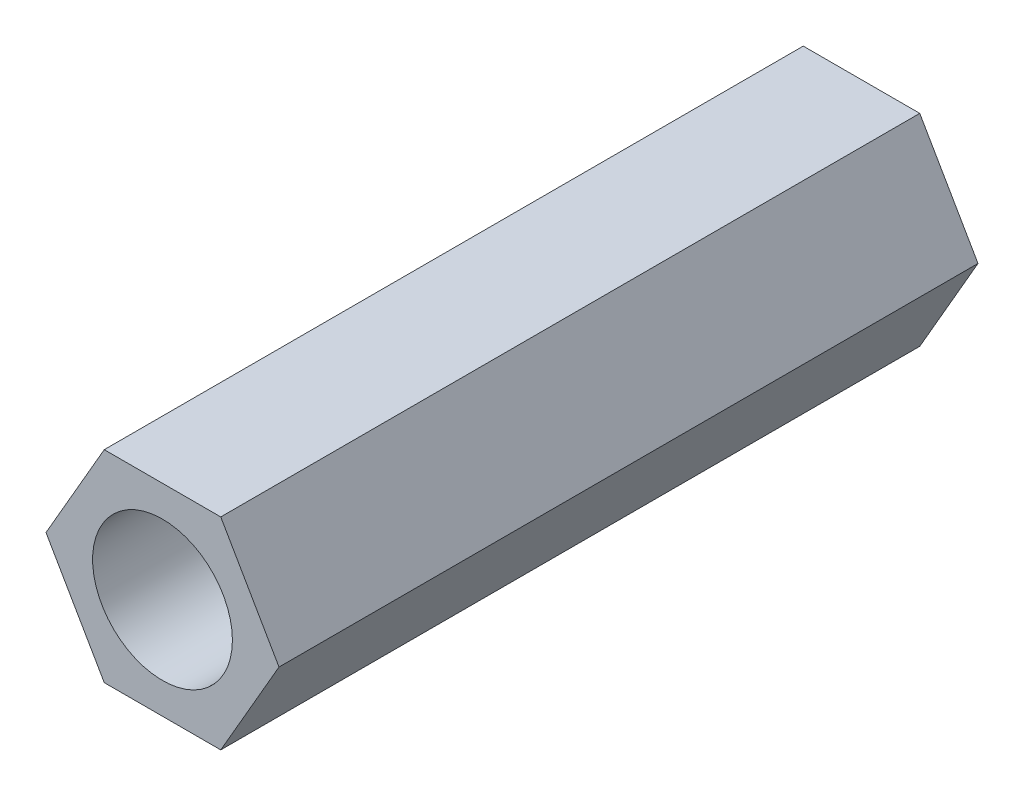
ISO-10303-21;
HEADER;
FILE_DESCRIPTION(('STEP AP214'),'2;1');
FILE_NAME('part.step','',(''),(''),'','','');
FILE_SCHEMA(('AUTOMOTIVE_DESIGN { 1 0 10303 214 1 1 1 1 }'));
ENDSEC;
DATA;
#1=APPLICATION_CONTEXT('core data for automotive mechanical design processes');
#2=APPLICATION_PROTOCOL_DEFINITION('international standard','automotive_design',2000,#1);
#3=PRODUCT_CONTEXT('',#1,'mechanical');
#4=PRODUCT('Part','Part','',(#3));
#5=PRODUCT_RELATED_PRODUCT_CATEGORY('part','',(#4));
#6=PRODUCT_DEFINITION_FORMATION('','',#4);
#7=PRODUCT_DEFINITION_CONTEXT('part definition',#1,'design');
#8=PRODUCT_DEFINITION('design','',#6,#7);
#9=PRODUCT_DEFINITION_SHAPE('','',#8);
#10=(LENGTH_UNIT() NAMED_UNIT(*) SI_UNIT(.MILLI.,.METRE.));
#11=(NAMED_UNIT(*) PLANE_ANGLE_UNIT() SI_UNIT($,.RADIAN.));
#12=(NAMED_UNIT(*) SI_UNIT($,.STERADIAN.) SOLID_ANGLE_UNIT());
#13=UNCERTAINTY_MEASURE_WITH_UNIT(LENGTH_MEASURE(1.E-05),#10,'distance_accuracy_value','');
#14=(GEOMETRIC_REPRESENTATION_CONTEXT(3) GLOBAL_UNCERTAINTY_ASSIGNED_CONTEXT((#13)) GLOBAL_UNIT_ASSIGNED_CONTEXT((#10,
#11,#12)) REPRESENTATION_CONTEXT('',''));
#15=CARTESIAN_POINT('',(0.,0.,0.));
#16=DIRECTION('',(0.,0.,1.));
#17=DIRECTION('',(1.,0.,0.));
#18=AXIS2_PLACEMENT_3D('',#15,#16,#17);
#19=CARTESIAN_POINT('',(0.,0.,15.));
#20=DIRECTION('',(0.,0.,1.));
#21=DIRECTION('',(1.,0.,0.));
#22=AXIS2_PLACEMENT_3D('',#19,#20,#21);
#23=PLANE('',#22);
#24=DIRECTION('',(0.499999999999995,0.866025403784441,0.));
#25=VECTOR('',#24,1.);
#26=CARTESIAN_POINT('',(1.25000000000002,-2.16506350946108,15.));
#27=LINE('',#26,#25);
#28=CARTESIAN_POINT('',(1.25000000000002,-2.16506350946108,15.));
#29=VERTEX_POINT('',#28);
#30=CARTESIAN_POINT('',(2.5,0.,15.));
#31=VERTEX_POINT('',#30);
#32=EDGE_CURVE('E152',#29,#31,#27,.T.);
#33=ORIENTED_EDGE('',*,*,#32,.T.);
#34=DIRECTION('',(-0.500000000000001,0.866025403784438,0.));
#35=VECTOR('',#34,1.);
#36=CARTESIAN_POINT('',(2.5,0.,15.));
#37=LINE('',#36,#35);
#38=CARTESIAN_POINT('',(1.25,2.1650635094611,15.));
#39=VERTEX_POINT('',#38);
#40=EDGE_CURVE('E100',#31,#39,#37,.T.);
#41=ORIENTED_EDGE('',*,*,#40,.T.);
#42=DIRECTION('',(-1.,0.,0.));
#43=VECTOR('',#42,1.);
#44=CARTESIAN_POINT('',(1.25,2.1650635094611,15.));
#45=LINE('',#44,#43);
#46=CARTESIAN_POINT('',(-1.25000000000001,2.16506350946109,15.));
#47=VERTEX_POINT('',#46);
#48=EDGE_CURVE('E113',#39,#47,#45,.T.);
#49=ORIENTED_EDGE('',*,*,#48,.T.);
#50=DIRECTION('',(-0.499999999999995,-0.866025403784442,0.));
#51=VECTOR('',#50,1.);
#52=CARTESIAN_POINT('',(-1.25000000000001,2.16506350946109,15.));
#53=LINE('',#52,#51);
#54=CARTESIAN_POINT('',(-2.5,0.,15.));
#55=VERTEX_POINT('',#54);
#56=EDGE_CURVE('E107',#47,#55,#53,.T.);
#57=ORIENTED_EDGE('',*,*,#56,.T.);
#58=DIRECTION('',(0.500000000000007,-0.866025403784434,0.));
#59=VECTOR('',#58,1.);
#60=CARTESIAN_POINT('',(-2.5,0.,15.));
#61=LINE('',#60,#59);
#62=CARTESIAN_POINT('',(-1.24999999999998,-2.16506350946111,15.));
#63=VERTEX_POINT('',#62);
#64=EDGE_CURVE('E111',#55,#63,#61,.T.);
#65=ORIENTED_EDGE('',*,*,#64,.T.);
#66=DIRECTION('',(1.,0.,0.));
#67=VECTOR('',#66,1.);
#68=CARTESIAN_POINT('',(-1.24999999999998,-2.16506350946111,15.));
#69=LINE('',#68,#67);
#70=EDGE_CURVE('E63',#63,#29,#69,.T.);
#71=ORIENTED_EDGE('',*,*,#70,.T.);
#72=EDGE_LOOP('',(#33,#41,#49,#57,#65,#71));
#73=FACE_BOUND('',#72,.T.);
#74=CARTESIAN_POINT('',(0.,0.,15.));
#75=DIRECTION('',(0.,0.,1.));
#76=DIRECTION('',(1.,0.,0.));
#77=AXIS2_PLACEMENT_3D('',#74,#75,#76);
#78=CIRCLE('',#77,1.5);
#79=CARTESIAN_POINT('',(1.5,0.,15.));
#80=VERTEX_POINT('',#79);
#81=EDGE_CURVE('E140',#80,#80,#78,.T.);
#82=ORIENTED_EDGE('',*,*,#81,.F.);
#83=EDGE_LOOP('',(#82));
#84=FACE_BOUND('',#83,.T.);
#85=ADVANCED_FACE('F45',(#73,#84),#23,.T.);
#86=CARTESIAN_POINT('',(0.,0.,0.));
#87=DIRECTION('',(0.,0.,1.));
#88=DIRECTION('',(1.,0.,0.));
#89=AXIS2_PLACEMENT_3D('',#86,#87,#88);
#90=PLANE('',#89);
#91=DIRECTION('',(0.499999999999995,0.866025403784441,0.));
#92=VECTOR('',#91,1.);
#93=CARTESIAN_POINT('',(1.25000000000002,-2.16506350946108,0.));
#94=LINE('',#93,#92);
#95=CARTESIAN_POINT('',(1.25000000000002,-2.16506350946108,0.));
#96=VERTEX_POINT('',#95);
#97=CARTESIAN_POINT('',(2.5,0.,0.));
#98=VERTEX_POINT('',#97);
#99=EDGE_CURVE('E135',#96,#98,#94,.T.);
#100=ORIENTED_EDGE('',*,*,#99,.F.);
#101=DIRECTION('',(1.,0.,0.));
#102=VECTOR('',#101,1.);
#103=CARTESIAN_POINT('',(-1.24999999999998,-2.16506350946111,0.));
#104=LINE('',#103,#102);
#105=CARTESIAN_POINT('',(-1.24999999999998,-2.16506350946111,0.));
#106=VERTEX_POINT('',#105);
#107=EDGE_CURVE('E92',#106,#96,#104,.T.);
#108=ORIENTED_EDGE('',*,*,#107,.F.);
#109=DIRECTION('',(0.500000000000007,-0.866025403784434,0.));
#110=VECTOR('',#109,1.);
#111=CARTESIAN_POINT('',(-2.5,0.,0.));
#112=LINE('',#111,#110);
#113=CARTESIAN_POINT('',(-2.5,0.,0.));
#114=VERTEX_POINT('',#113);
#115=EDGE_CURVE('E86',#114,#106,#112,.T.);
#116=ORIENTED_EDGE('',*,*,#115,.F.);
#117=DIRECTION('',(-0.499999999999995,-0.866025403784442,0.));
#118=VECTOR('',#117,1.);
#119=CARTESIAN_POINT('',(-1.25000000000001,2.16506350946109,0.));
#120=LINE('',#119,#118);
#121=CARTESIAN_POINT('',(-1.25000000000001,2.16506350946109,0.));
#122=VERTEX_POINT('',#121);
#123=EDGE_CURVE('E122',#122,#114,#120,.T.);
#124=ORIENTED_EDGE('',*,*,#123,.F.);
#125=DIRECTION('',(-1.,0.,0.));
#126=VECTOR('',#125,1.);
#127=CARTESIAN_POINT('',(1.25,2.1650635094611,0.));
#128=LINE('',#127,#126);
#129=CARTESIAN_POINT('',(1.25,2.1650635094611,0.));
#130=VERTEX_POINT('',#129);
#131=EDGE_CURVE('E143',#130,#122,#128,.T.);
#132=ORIENTED_EDGE('',*,*,#131,.F.);
#133=DIRECTION('',(-0.500000000000001,0.866025403784438,0.));
#134=VECTOR('',#133,1.);
#135=CARTESIAN_POINT('',(2.5,0.,0.));
#136=LINE('',#135,#134);
#137=EDGE_CURVE('E139',#98,#130,#136,.T.);
#138=ORIENTED_EDGE('',*,*,#137,.F.);
#139=EDGE_LOOP('',(#100,#108,#116,#124,#132,#138));
#140=FACE_BOUND('',#139,.T.);
#141=CARTESIAN_POINT('',(0.,0.,0.));
#142=DIRECTION('',(0.,0.,1.));
#143=DIRECTION('',(1.,0.,0.));
#144=AXIS2_PLACEMENT_3D('',#141,#142,#143);
#145=CIRCLE('',#144,1.5);
#146=CARTESIAN_POINT('',(1.5,0.,0.));
#147=VERTEX_POINT('',#146);
#148=EDGE_CURVE('E249',#147,#147,#145,.T.);
#149=ORIENTED_EDGE('',*,*,#148,.T.);
#150=EDGE_LOOP('',(#149));
#151=FACE_BOUND('',#150,.T.);
#152=ADVANCED_FACE('F165',(#140,#151),#90,.F.);
#153=CARTESIAN_POINT('',(1.25000000000002,-2.16506350946108,15.));
#154=DIRECTION('',(-0.866025403784441,0.499999999999995,0.));
#155=DIRECTION('',(-0.499999999999995,-0.866025403784441,0.));
#156=AXIS2_PLACEMENT_3D('',#153,#154,#155);
#157=PLANE('',#156);
#158=ORIENTED_EDGE('',*,*,#99,.T.);
#159=DIRECTION('',(0.,0.,-1.));
#160=VECTOR('',#159,1.);
#161=CARTESIAN_POINT('',(2.5,0.,15.));
#162=LINE('',#161,#160);
#163=EDGE_CURVE('E11',#31,#98,#162,.T.);
#164=ORIENTED_EDGE('',*,*,#163,.F.);
#165=ORIENTED_EDGE('',*,*,#32,.F.);
#166=DIRECTION('',(0.,0.,-1.));
#167=VECTOR('',#166,1.);
#168=CARTESIAN_POINT('',(1.25000000000002,-2.16506350946108,15.));
#169=LINE('',#168,#167);
#170=EDGE_CURVE('E131',#29,#96,#169,.T.);
#171=ORIENTED_EDGE('',*,*,#170,.T.);
#172=EDGE_LOOP('',(#158,#164,#165,#171));
#173=FACE_BOUND('',#172,.T.);
#174=ADVANCED_FACE('F47',(#173),#157,.F.);
#175=CARTESIAN_POINT('',(2.5,0.,15.));
#176=DIRECTION('',(-0.866025403784438,-0.500000000000001,0.));
#177=DIRECTION('',(0.500000000000001,-0.866025403784438,0.));
#178=AXIS2_PLACEMENT_3D('',#175,#176,#177);
#179=PLANE('',#178);
#180=ORIENTED_EDGE('',*,*,#137,.T.);
#181=DIRECTION('',(0.,0.,-1.));
#182=VECTOR('',#181,1.);
#183=CARTESIAN_POINT('',(1.25,2.1650635094611,15.));
#184=LINE('',#183,#182);
#185=EDGE_CURVE('E55',#39,#130,#184,.T.);
#186=ORIENTED_EDGE('',*,*,#185,.F.);
#187=ORIENTED_EDGE('',*,*,#40,.F.);
#188=ORIENTED_EDGE('',*,*,#163,.T.);
#189=EDGE_LOOP('',(#180,#186,#187,#188));
#190=FACE_BOUND('',#189,.T.);
#191=ADVANCED_FACE('F190',(#190),#179,.F.);
#192=CARTESIAN_POINT('',(1.25,2.1650635094611,15.));
#193=DIRECTION('',(0.,-1.,0.));
#194=DIRECTION('',(1.,0.,0.));
#195=AXIS2_PLACEMENT_3D('',#192,#193,#194);
#196=PLANE('',#195);
#197=ORIENTED_EDGE('',*,*,#131,.T.);
#198=DIRECTION('',(0.,0.,-1.));
#199=VECTOR('',#198,1.);
#200=CARTESIAN_POINT('',(-1.25000000000001,2.16506350946109,15.));
#201=LINE('',#200,#199);
#202=EDGE_CURVE('E124',#47,#122,#201,.T.);
#203=ORIENTED_EDGE('',*,*,#202,.F.);
#204=ORIENTED_EDGE('',*,*,#48,.F.);
#205=ORIENTED_EDGE('',*,*,#185,.T.);
#206=EDGE_LOOP('',(#197,#203,#204,#205));
#207=FACE_BOUND('',#206,.T.);
#208=ADVANCED_FACE('F162',(#207),#196,.F.);
#209=CARTESIAN_POINT('',(-1.25000000000001,2.16506350946109,15.));
#210=DIRECTION('',(0.866025403784442,-0.499999999999995,0.));
#211=DIRECTION('',(0.499999999999995,0.866025403784442,0.));
#212=AXIS2_PLACEMENT_3D('',#209,#210,#211);
#213=PLANE('',#212);
#214=ORIENTED_EDGE('',*,*,#123,.T.);
#215=DIRECTION('',(0.,0.,-1.));
#216=VECTOR('',#215,1.);
#217=CARTESIAN_POINT('',(-2.5,0.,15.));
#218=LINE('',#217,#216);
#219=EDGE_CURVE('E119',#55,#114,#218,.T.);
#220=ORIENTED_EDGE('',*,*,#219,.F.);
#221=ORIENTED_EDGE('',*,*,#56,.F.);
#222=ORIENTED_EDGE('',*,*,#202,.T.);
#223=EDGE_LOOP('',(#214,#220,#221,#222));
#224=FACE_BOUND('',#223,.T.);
#225=ADVANCED_FACE('F120',(#224),#213,.F.);
#226=CARTESIAN_POINT('',(-2.5,0.,15.));
#227=DIRECTION('',(0.866025403784435,0.500000000000007,0.));
#228=DIRECTION('',(-0.500000000000007,0.866025403784435,0.));
#229=AXIS2_PLACEMENT_3D('',#226,#227,#228);
#230=PLANE('',#229);
#231=ORIENTED_EDGE('',*,*,#115,.T.);
#232=DIRECTION('',(0.,0.,-1.));
#233=VECTOR('',#232,1.);
#234=CARTESIAN_POINT('',(-1.24999999999998,-2.16506350946111,15.));
#235=LINE('',#234,#233);
#236=EDGE_CURVE('E125',#63,#106,#235,.T.);
#237=ORIENTED_EDGE('',*,*,#236,.F.);
#238=ORIENTED_EDGE('',*,*,#64,.F.);
#239=ORIENTED_EDGE('',*,*,#219,.T.);
#240=EDGE_LOOP('',(#231,#237,#238,#239));
#241=FACE_BOUND('',#240,.T.);
#242=ADVANCED_FACE('F127',(#241),#230,.F.);
#243=CARTESIAN_POINT('',(-1.24999999999998,-2.16506350946111,15.));
#244=DIRECTION('',(0.,1.,0.));
#245=DIRECTION('',(-1.,0.,0.));
#246=AXIS2_PLACEMENT_3D('',#243,#244,#245);
#247=PLANE('',#246);
#248=ORIENTED_EDGE('',*,*,#107,.T.);
#249=ORIENTED_EDGE('',*,*,#170,.F.);
#250=ORIENTED_EDGE('',*,*,#70,.F.);
#251=ORIENTED_EDGE('',*,*,#236,.T.);
#252=EDGE_LOOP('',(#248,#249,#250,#251));
#253=FACE_BOUND('',#252,.T.);
#254=ADVANCED_FACE('F170',(#253),#247,.F.);
#255=CARTESIAN_POINT('',(0.,0.,15.));
#256=DIRECTION('',(0.,0.,-1.));
#257=DIRECTION('',(-1.,0.,0.));
#258=AXIS2_PLACEMENT_3D('',#255,#256,#257);
#259=CYLINDRICAL_SURFACE('',#258,1.5);
#260=ORIENTED_EDGE('',*,*,#81,.T.);
#261=EDGE_LOOP('',(#260));
#262=FACE_BOUND('',#261,.T.);
#263=ORIENTED_EDGE('',*,*,#148,.F.);
#264=EDGE_LOOP('',(#263));
#265=FACE_BOUND('',#264,.T.);
#266=ADVANCED_FACE('F172',(#262,#265),#259,.F.);
#267=CLOSED_SHELL('',(#85,#152,#174,#191,#208,#225,#242,#254,#266));
#268=MANIFOLD_SOLID_BREP('B2',#267);
#269=ADVANCED_BREP_SHAPE_REPRESENTATION('',(#18,#268),#14);
#270=SHAPE_DEFINITION_REPRESENTATION(#9,#269);
ENDSEC;
END-ISO-10303-21;
